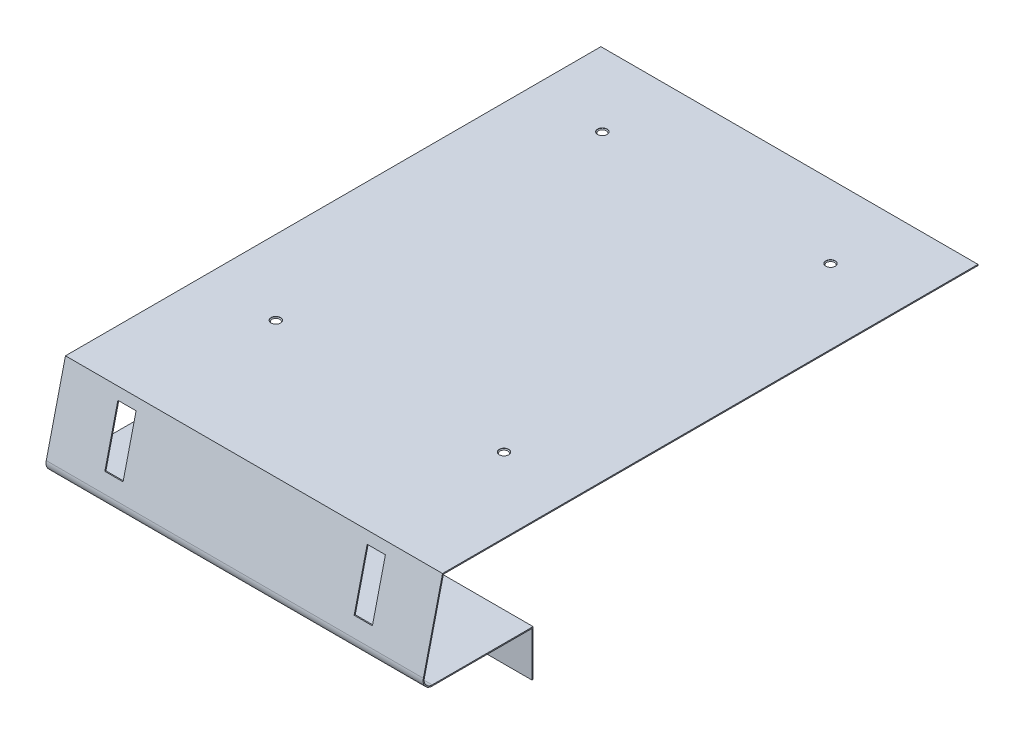
ISO-10303-21;
HEADER;
FILE_DESCRIPTION(('STEP AP214'),'2;1');
FILE_NAME('part.step','',(''),(''),'','','');
FILE_SCHEMA(('AUTOMOTIVE_DESIGN { 1 0 10303 214 1 1 1 1 }'));
ENDSEC;
DATA;
#1=APPLICATION_CONTEXT('core data for automotive mechanical design processes');
#2=APPLICATION_PROTOCOL_DEFINITION('international standard','automotive_design',2000,#1);
#3=PRODUCT_CONTEXT('',#1,'mechanical');
#4=PRODUCT('Part','Part','',(#3));
#5=PRODUCT_RELATED_PRODUCT_CATEGORY('part','',(#4));
#6=PRODUCT_DEFINITION_FORMATION('','',#4);
#7=PRODUCT_DEFINITION_CONTEXT('part definition',#1,'design');
#8=PRODUCT_DEFINITION('design','',#6,#7);
#9=PRODUCT_DEFINITION_SHAPE('','',#8);
#10=(LENGTH_UNIT() NAMED_UNIT(*) SI_UNIT(.MILLI.,.METRE.));
#11=(NAMED_UNIT(*) PLANE_ANGLE_UNIT() SI_UNIT($,.RADIAN.));
#12=(NAMED_UNIT(*) SI_UNIT($,.STERADIAN.) SOLID_ANGLE_UNIT());
#13=UNCERTAINTY_MEASURE_WITH_UNIT(LENGTH_MEASURE(1.E-05),#10,'distance_accuracy_value','');
#14=(GEOMETRIC_REPRESENTATION_CONTEXT(3) GLOBAL_UNCERTAINTY_ASSIGNED_CONTEXT((#13)) GLOBAL_UNIT_ASSIGNED_CONTEXT((#10,
#11,#12)) REPRESENTATION_CONTEXT('',''));
#15=CARTESIAN_POINT('',(0.,0.,0.));
#16=DIRECTION('',(0.,0.,1.));
#17=DIRECTION('',(1.,0.,0.));
#18=AXIS2_PLACEMENT_3D('',#15,#16,#17);
#19=CARTESIAN_POINT('',(-206.6,0.,293.957235481432));
#20=DIRECTION('',(0.,-0.230389426676569,-0.973098510982132));
#21=DIRECTION('',(0.,0.973098510982132,-0.230389426676569));
#22=AXIS2_PLACEMENT_3D('',#19,#20,#21);
#23=PLANE('',#22);
#24=DIRECTION('',(-1.,0.,0.));
#25=VECTOR('',#24,1.);
#26=CARTESIAN_POINT('',(-126.6,-9.7235326879881,296.259365323349));
#27=LINE('',#26,#25);
#28=CARTESIAN_POINT('',(-126.6,-9.7235326879881,296.259365323349));
#29=VERTEX_POINT('',#28);
#30=CARTESIAN_POINT('',(-146.6,-9.7235326879881,296.259365323349));
#31=VERTEX_POINT('',#30);
#32=EDGE_CURVE('E239',#29,#31,#27,.T.);
#33=ORIENTED_EDGE('',*,*,#32,.F.);
#34=DIRECTION('',(0.,-0.973098510982132,0.230389426676569));
#35=VECTOR('',#34,1.);
#36=CARTESIAN_POINT('',(-126.6,131.604562164318,262.798725543465));
#37=LINE('',#36,#35);
#38=CARTESIAN_POINT('',(-126.6,-70.,310.530336442282));
#39=VERTEX_POINT('',#38);
#40=EDGE_CURVE('E260',#29,#39,#37,.T.);
#41=ORIENTED_EDGE('',*,*,#40,.T.);
#42=DIRECTION('',(1.,0.,0.));
#43=VECTOR('',#42,1.);
#44=CARTESIAN_POINT('',(0.,-70.,310.530336442282));
#45=LINE('',#44,#43);
#46=CARTESIAN_POINT('',(-146.6,-70.,310.530336442282));
#47=VERTEX_POINT('',#46);
#48=EDGE_CURVE('E257',#47,#39,#45,.T.);
#49=ORIENTED_EDGE('',*,*,#48,.F.);
#50=DIRECTION('',(0.,-0.973098510982132,0.230389426676569));
#51=VECTOR('',#50,1.);
#52=CARTESIAN_POINT('',(-146.6,131.604562164318,262.798725543465));
#53=LINE('',#52,#51);
#54=EDGE_CURVE('E254',#31,#47,#53,.T.);
#55=ORIENTED_EDGE('',*,*,#54,.F.);
#56=EDGE_LOOP('',(#33,#41,#49,#55));
#57=FACE_BOUND('',#56,.T.);
#58=DIRECTION('',(1.,0.,0.));
#59=VECTOR('',#58,1.);
#60=CARTESIAN_POINT('',(-206.6,1.2,293.673125179246));
#61=LINE('',#60,#59);
#62=CARTESIAN_POINT('',(-206.6,1.2,293.673125179246));
#63=VERTEX_POINT('',#62);
#64=CARTESIAN_POINT('',(206.6,1.2,293.673125179246));
#65=VERTEX_POINT('',#64);
#66=EDGE_CURVE('E416',#63,#65,#61,.T.);
#67=ORIENTED_EDGE('',*,*,#66,.F.);
#68=DIRECTION('',(0.,0.973098510982132,-0.230389426676569));
#69=VECTOR('',#68,1.);
#70=CARTESIAN_POINT('',(-206.6,0.,293.957235481432));
#71=LINE('',#70,#69);
#72=CARTESIAN_POINT('',(-206.6,-87.6961057332343,314.720041398436));
#73=VERTEX_POINT('',#72);
#74=EDGE_CURVE('E413',#73,#63,#71,.T.);
#75=ORIENTED_EDGE('',*,*,#74,.F.);
#76=DIRECTION('',(1.,0.,0.));
#77=VECTOR('',#76,1.);
#78=CARTESIAN_POINT('',(-206.6,-87.6961057332343,314.720041398436));
#79=LINE('',#78,#77);
#80=CARTESIAN_POINT('',(206.6,-87.6961057332343,314.720041398436));
#81=VERTEX_POINT('',#80);
#82=EDGE_CURVE('E362',#73,#81,#79,.T.);
#83=ORIENTED_EDGE('',*,*,#82,.T.);
#84=DIRECTION('',(0.,0.973098510982132,-0.230389426676569));
#85=VECTOR('',#84,1.);
#86=CARTESIAN_POINT('',(206.6,0.,293.957235481432));
#87=LINE('',#86,#85);
#88=EDGE_CURVE('E388',#81,#65,#87,.T.);
#89=ORIENTED_EDGE('',*,*,#88,.T.);
#90=EDGE_LOOP('',(#67,#75,#83,#89));
#91=FACE_BOUND('',#90,.T.);
#92=DIRECTION('',(0.,-0.973098510982132,0.230389426676569));
#93=VECTOR('',#92,1.);
#94=CARTESIAN_POINT('',(126.6,131.604562164318,262.798725543465));
#95=LINE('',#94,#93);
#96=CARTESIAN_POINT('',(126.6,-9.7235326879881,296.259365323349));
#97=VERTEX_POINT('',#96);
#98=CARTESIAN_POINT('',(126.6,-70.,310.530336442282));
#99=VERTEX_POINT('',#98);
#100=EDGE_CURVE('E198',#97,#99,#95,.T.);
#101=ORIENTED_EDGE('',*,*,#100,.F.);
#102=DIRECTION('',(1.,0.,0.));
#103=VECTOR('',#102,1.);
#104=CARTESIAN_POINT('',(126.6,-9.7235326879881,296.259365323349));
#105=LINE('',#104,#103);
#106=CARTESIAN_POINT('',(146.6,-9.7235326879881,296.259365323349));
#107=VERTEX_POINT('',#106);
#108=EDGE_CURVE('E201',#97,#107,#105,.T.);
#109=ORIENTED_EDGE('',*,*,#108,.T.);
#110=DIRECTION('',(0.,-0.973098510982132,0.230389426676569));
#111=VECTOR('',#110,1.);
#112=CARTESIAN_POINT('',(146.6,131.604562164318,262.798725543465));
#113=LINE('',#112,#111);
#114=CARTESIAN_POINT('',(146.6,-70.,310.530336442282));
#115=VERTEX_POINT('',#114);
#116=EDGE_CURVE('E269',#107,#115,#113,.T.);
#117=ORIENTED_EDGE('',*,*,#116,.T.);
#118=DIRECTION('',(-1.,0.,0.));
#119=VECTOR('',#118,1.);
#120=CARTESIAN_POINT('',(1.4773281960804E-13,-70.,310.530336442282));
#121=LINE('',#120,#119);
#122=EDGE_CURVE('E203',#115,#99,#121,.T.);
#123=ORIENTED_EDGE('',*,*,#122,.T.);
#124=EDGE_LOOP('',(#101,#109,#117,#123));
#125=FACE_BOUND('',#124,.T.);
#126=ADVANCED_FACE('F34',(#57,#91,#125),#23,.F.);
#127=CARTESIAN_POINT('',(-206.6,-0.276467312011879,292.789517268254));
#128=DIRECTION('',(0.,-0.230389426676557,-0.973098510982135));
#129=DIRECTION('',(0.,0.973098510982135,-0.230389426676557));
#130=AXIS2_PLACEMENT_3D('',#127,#128,#129);
#131=PLANE('',#130);
#132=DIRECTION('',(0.,0.973098510982134,-0.230389426676557));
#133=VECTOR('',#132,1.);
#134=CARTESIAN_POINT('',(206.6,-0.276467312011879,292.789517268254));
#135=LINE('',#134,#133);
#136=CARTESIAN_POINT('',(206.6,-87.9725730452462,313.552323185258));
#137=VERTEX_POINT('',#136);
#138=CARTESIAN_POINT('',(206.6,0.,292.72406125862));
#139=VERTEX_POINT('',#138);
#140=EDGE_CURVE('E341',#137,#139,#135,.T.);
#141=ORIENTED_EDGE('',*,*,#140,.F.);
#142=DIRECTION('',(1.,0.,0.));
#143=VECTOR('',#142,1.);
#144=CARTESIAN_POINT('',(-206.6,-87.9725730452462,313.552323185258));
#145=LINE('',#144,#143);
#146=CARTESIAN_POINT('',(-206.6,-87.9725730452462,313.552323185258));
#147=VERTEX_POINT('',#146);
#148=EDGE_CURVE('E389',#147,#137,#145,.T.);
#149=ORIENTED_EDGE('',*,*,#148,.F.);
#150=DIRECTION('',(0.,0.973098510982132,-0.230389426676569));
#151=VECTOR('',#150,1.);
#152=CARTESIAN_POINT('',(-206.6,-0.276467312011879,292.789517268254));
#153=LINE('',#152,#151);
#154=CARTESIAN_POINT('',(-206.6,0.,292.72406125862));
#155=VERTEX_POINT('',#154);
#156=EDGE_CURVE('E359',#147,#155,#153,.T.);
#157=ORIENTED_EDGE('',*,*,#156,.T.);
#158=DIRECTION('',(1.,0.,0.));
#159=VECTOR('',#158,1.);
#160=CARTESIAN_POINT('',(-206.6,0.,292.72406125862));
#161=LINE('',#160,#159);
#162=EDGE_CURVE('E385',#155,#139,#161,.T.);
#163=ORIENTED_EDGE('',*,*,#162,.T.);
#164=EDGE_LOOP('',(#141,#149,#157,#163));
#165=FACE_BOUND('',#164,.T.);
#166=DIRECTION('',(-1.,0.,0.));
#167=VECTOR('',#166,1.);
#168=CARTESIAN_POINT('',(-126.6,-70.0835154141931,309.316935210773));
#169=LINE('',#168,#167);
#170=CARTESIAN_POINT('',(-126.6,-70.0835154141931,309.316935210773));
#171=VERTEX_POINT('',#170);
#172=CARTESIAN_POINT('',(-146.6,-70.0835154141931,309.316935210773));
#173=VERTEX_POINT('',#172);
#174=EDGE_CURVE('E246',#171,#173,#169,.T.);
#175=ORIENTED_EDGE('',*,*,#174,.F.);
#176=DIRECTION('',(0.,-0.973098510982135,0.230389426676557));
#177=VECTOR('',#176,1.);
#178=CARTESIAN_POINT('',(-126.6,131.3280948523,261.631007330289));
#179=LINE('',#178,#177);
#180=CARTESIAN_POINT('',(-126.6,-10.,295.09164711017));
#181=VERTEX_POINT('',#180);
#182=EDGE_CURVE('E251',#181,#171,#179,.T.);
#183=ORIENTED_EDGE('',*,*,#182,.F.);
#184=DIRECTION('',(1.,0.,0.));
#185=VECTOR('',#184,1.);
#186=CARTESIAN_POINT('',(0.,-10.,295.09164711017));
#187=LINE('',#186,#185);
#188=CARTESIAN_POINT('',(-146.6,-10.,295.09164711017));
#189=VERTEX_POINT('',#188);
#190=EDGE_CURVE('E263',#189,#181,#187,.T.);
#191=ORIENTED_EDGE('',*,*,#190,.F.);
#192=DIRECTION('',(0.,-0.973098510982135,0.230389426676557));
#193=VECTOR('',#192,1.);
#194=CARTESIAN_POINT('',(-146.6,131.3280948523,261.631007330289));
#195=LINE('',#194,#193);
#196=EDGE_CURVE('E249',#189,#173,#195,.T.);
#197=ORIENTED_EDGE('',*,*,#196,.T.);
#198=EDGE_LOOP('',(#175,#183,#191,#197));
#199=FACE_BOUND('',#198,.T.);
#200=DIRECTION('',(0.,-0.973098510982135,0.230389426676557));
#201=VECTOR('',#200,1.);
#202=CARTESIAN_POINT('',(126.6,131.3280948523,261.631007330289));
#203=LINE('',#202,#201);
#204=CARTESIAN_POINT('',(126.6,-10.,295.09164711017));
#205=VERTEX_POINT('',#204);
#206=CARTESIAN_POINT('',(126.6,-70.0835154141931,309.316935210773));
#207=VERTEX_POINT('',#206);
#208=EDGE_CURVE('E220',#205,#207,#203,.T.);
#209=ORIENTED_EDGE('',*,*,#208,.T.);
#210=DIRECTION('',(1.,0.,0.));
#211=VECTOR('',#210,1.);
#212=CARTESIAN_POINT('',(126.6,-70.0835154141931,309.316935210773));
#213=LINE('',#212,#211);
#214=CARTESIAN_POINT('',(146.6,-70.0835154141931,309.316935210773));
#215=VERTEX_POINT('',#214);
#216=EDGE_CURVE('E217',#207,#215,#213,.T.);
#217=ORIENTED_EDGE('',*,*,#216,.T.);
#218=DIRECTION('',(0.,-0.973098510982135,0.230389426676557));
#219=VECTOR('',#218,1.);
#220=CARTESIAN_POINT('',(146.6,131.3280948523,261.631007330289));
#221=LINE('',#220,#219);
#222=CARTESIAN_POINT('',(146.6,-9.99999999999996,295.09164711017));
#223=VERTEX_POINT('',#222);
#224=EDGE_CURVE('E207',#223,#215,#221,.T.);
#225=ORIENTED_EDGE('',*,*,#224,.F.);
#226=DIRECTION('',(-1.,0.,0.));
#227=VECTOR('',#226,1.);
#228=CARTESIAN_POINT('',(1.22205331149274E-13,-10.,295.09164711017));
#229=LINE('',#228,#227);
#230=EDGE_CURVE('E252',#223,#205,#229,.T.);
#231=ORIENTED_EDGE('',*,*,#230,.T.);
#232=EDGE_LOOP('',(#209,#217,#225,#231));
#233=FACE_BOUND('',#232,.T.);
#234=ADVANCED_FACE('F434',(#165,#199,#233),#131,.T.);
#235=CARTESIAN_POINT('',(-206.6,-149.,195.633093996933));
#236=DIRECTION('',(0.,-1.,0.));
#237=DIRECTION('',(0.,0.,-1.));
#238=AXIS2_PLACEMENT_3D('',#235,#236,#237);
#239=PLANE('',#238);
#240=DIRECTION('',(0.,0.,1.));
#241=VECTOR('',#240,1.);
#242=CARTESIAN_POINT('',(-40.,-149.,-293.061));
#243=LINE('',#242,#241);
#244=CARTESIAN_POINT('',(-40.,-149.,194.433093996933));
#245=VERTEX_POINT('',#244);
#246=CARTESIAN_POINT('',(-40.,-149.,195.633093996932));
#247=VERTEX_POINT('',#246);
#248=EDGE_CURVE('E283',#245,#247,#243,.T.);
#249=ORIENTED_EDGE('',*,*,#248,.T.);
#250=DIRECTION('',(1.,0.,0.));
#251=VECTOR('',#250,1.);
#252=CARTESIAN_POINT('',(-206.6,-149.,195.633093996933));
#253=LINE('',#252,#251);
#254=CARTESIAN_POINT('',(-206.6,-149.,195.633093996933));
#255=VERTEX_POINT('',#254);
#256=EDGE_CURVE('E400',#255,#247,#253,.T.);
#257=ORIENTED_EDGE('',*,*,#256,.F.);
#258=DIRECTION('',(0.,0.,-1.));
#259=VECTOR('',#258,1.);
#260=CARTESIAN_POINT('',(-206.6,-149.,195.633093996933));
#261=LINE('',#260,#259);
#262=CARTESIAN_POINT('',(-206.6,-149.,194.433093996933));
#263=VERTEX_POINT('',#262);
#264=EDGE_CURVE('E347',#255,#263,#261,.T.);
#265=ORIENTED_EDGE('',*,*,#264,.T.);
#266=DIRECTION('',(1.,0.,0.));
#267=VECTOR('',#266,1.);
#268=CARTESIAN_POINT('',(-206.6,-149.,194.433093996933));
#269=LINE('',#268,#267);
#270=EDGE_CURVE('E396',#263,#245,#269,.T.);
#271=ORIENTED_EDGE('',*,*,#270,.T.);
#272=EDGE_LOOP('',(#249,#257,#265,#271));
#273=FACE_BOUND('',#272,.T.);
#274=ADVANCED_FACE('F449',(#273),#239,.T.);
#275=CARTESIAN_POINT('',(-206.6,-100.,195.633093996933));
#276=DIRECTION('',(0.,0.,1.));
#277=DIRECTION('',(0.,-1.,0.));
#278=AXIS2_PLACEMENT_3D('',#275,#276,#277);
#279=PLANE('',#278);
#280=DIRECTION('',(0.,-1.,0.));
#281=VECTOR('',#280,1.);
#282=CARTESIAN_POINT('',(-40.,-149.,195.633093996932));
#283=LINE('',#282,#281);
#284=CARTESIAN_POINT('',(-40.,-99.9999999999998,195.633093996932));
#285=VERTEX_POINT('',#284);
#286=EDGE_CURVE('E280',#285,#247,#283,.T.);
#287=ORIENTED_EDGE('',*,*,#286,.F.);
#288=DIRECTION('',(1.,0.,0.));
#289=VECTOR('',#288,1.);
#290=CARTESIAN_POINT('',(-206.6,-100.,195.633093996933));
#291=LINE('',#290,#289);
#292=CARTESIAN_POINT('',(-206.6,-100.,195.633093996933));
#293=VERTEX_POINT('',#292);
#294=EDGE_CURVE('E404',#293,#285,#291,.T.);
#295=ORIENTED_EDGE('',*,*,#294,.F.);
#296=DIRECTION('',(0.,-1.,0.));
#297=VECTOR('',#296,1.);
#298=CARTESIAN_POINT('',(-206.6,-100.,195.633093996933));
#299=LINE('',#298,#297);
#300=EDGE_CURVE('E344',#293,#255,#299,.T.);
#301=ORIENTED_EDGE('',*,*,#300,.T.);
#302=ORIENTED_EDGE('',*,*,#256,.T.);
#303=EDGE_LOOP('',(#287,#295,#301,#302));
#304=FACE_BOUND('',#303,.T.);
#305=ADVANCED_FACE('F454',(#304),#279,.T.);
#306=CARTESIAN_POINT('',(0.,0.,0.));
#307=DIRECTION('',(0.,1.,0.));
#308=DIRECTION('',(0.,0.,1.));
#309=AXIS2_PLACEMENT_3D('',#306,#307,#308);
#310=PLANE('',#309);
#311=CARTESIAN_POINT('',(-125.,0.,-213.06));
#312=DIRECTION('',(0.,1.,0.));
#313=DIRECTION('',(0.,0.,1.));
#314=AXIS2_PLACEMENT_3D('',#311,#312,#313);
#315=CIRCLE('',#314,4.3);
#316=CARTESIAN_POINT('',(-125.,0.,-208.76));
#317=VERTEX_POINT('',#316);
#318=EDGE_CURVE('E298',#317,#317,#315,.T.);
#319=ORIENTED_EDGE('',*,*,#318,.T.);
#320=EDGE_LOOP('',(#319));
#321=FACE_BOUND('',#320,.T.);
#322=CARTESIAN_POINT('',(125.,0.,-213.06));
#323=DIRECTION('',(0.,1.,0.));
#324=DIRECTION('',(0.,0.,1.));
#325=AXIS2_PLACEMENT_3D('',#322,#323,#324);
#326=CIRCLE('',#325,4.30000000000001);
#327=CARTESIAN_POINT('',(125.,0.,-208.76));
#328=VERTEX_POINT('',#327);
#329=EDGE_CURVE('E307',#328,#328,#326,.T.);
#330=ORIENTED_EDGE('',*,*,#329,.T.);
#331=EDGE_LOOP('',(#330));
#332=FACE_BOUND('',#331,.T.);
#333=CARTESIAN_POINT('',(125.,0.,144.74));
#334=DIRECTION('',(0.,1.,0.));
#335=DIRECTION('',(0.,0.,1.));
#336=AXIS2_PLACEMENT_3D('',#333,#334,#335);
#337=CIRCLE('',#336,4.30000000000001);
#338=CARTESIAN_POINT('',(125.,0.,149.04));
#339=VERTEX_POINT('',#338);
#340=EDGE_CURVE('E316',#339,#339,#337,.T.);
#341=ORIENTED_EDGE('',*,*,#340,.T.);
#342=EDGE_LOOP('',(#341));
#343=FACE_BOUND('',#342,.T.);
#344=CARTESIAN_POINT('',(-125.,0.,144.74));
#345=DIRECTION('',(0.,1.,0.));
#346=DIRECTION('',(0.,0.,1.));
#347=AXIS2_PLACEMENT_3D('',#344,#345,#346);
#348=CIRCLE('',#347,4.3);
#349=CARTESIAN_POINT('',(-125.,0.,149.04));
#350=VERTEX_POINT('',#349);
#351=EDGE_CURVE('E325',#350,#350,#348,.T.);
#352=ORIENTED_EDGE('',*,*,#351,.T.);
#353=EDGE_LOOP('',(#352));
#354=FACE_BOUND('',#353,.T.);
#355=DIRECTION('',(0.,0.,1.));
#356=VECTOR('',#355,1.);
#357=CARTESIAN_POINT('',(-206.6,0.,-294.06));
#358=LINE('',#357,#356);
#359=CARTESIAN_POINT('',(-206.6,0.,-293.06));
#360=VERTEX_POINT('',#359);
#361=EDGE_CURVE('E38',#360,#155,#358,.T.);
#362=ORIENTED_EDGE('',*,*,#361,.F.);
#363=DIRECTION('',(-1.,0.,0.));
#364=VECTOR('',#363,1.);
#365=CARTESIAN_POINT('',(-206.6,0.,-293.06));
#366=LINE('',#365,#364);
#367=CARTESIAN_POINT('',(206.6,0.,-293.06));
#368=VERTEX_POINT('',#367);
#369=EDGE_CURVE('E333',#368,#360,#366,.T.);
#370=ORIENTED_EDGE('',*,*,#369,.F.);
#371=DIRECTION('',(0.,0.,-1.));
#372=VECTOR('',#371,1.);
#373=CARTESIAN_POINT('',(206.6,0.,-294.06));
#374=LINE('',#373,#372);
#375=EDGE_CURVE('E419',#139,#368,#374,.T.);
#376=ORIENTED_EDGE('',*,*,#375,.F.);
#377=ORIENTED_EDGE('',*,*,#162,.F.);
#378=EDGE_LOOP('',(#362,#370,#376,#377));
#379=FACE_BOUND('',#378,.T.);
#380=ADVANCED_FACE('F432',(#321,#332,#343,#354,#379),#310,.F.);
#381=CARTESIAN_POINT('',(206.6,1.2,-294.06));
#382=DIRECTION('',(-1.,0.,0.));
#383=DIRECTION('',(0.,0.,1.));
#384=AXIS2_PLACEMENT_3D('',#381,#382,#383);
#385=PLANE('',#384);
#386=ORIENTED_EDGE('',*,*,#375,.T.);
#387=DIRECTION('',(0.,1.,0.));
#388=VECTOR('',#387,1.);
#389=CARTESIAN_POINT('',(206.6,-149.001,-293.06));
#390=LINE('',#389,#388);
#391=CARTESIAN_POINT('',(206.6,1.2,-293.06));
#392=VERTEX_POINT('',#391);
#393=EDGE_CURVE('E330',#368,#392,#390,.T.);
#394=ORIENTED_EDGE('',*,*,#393,.T.);
#395=DIRECTION('',(0.,0.,-1.));
#396=VECTOR('',#395,1.);
#397=CARTESIAN_POINT('',(206.6,1.2,-294.06));
#398=LINE('',#397,#396);
#399=EDGE_CURVE('E43',#65,#392,#398,.T.);
#400=ORIENTED_EDGE('',*,*,#399,.F.);
#401=ORIENTED_EDGE('',*,*,#88,.F.);
#402=CARTESIAN_POINT('',(206.6,-90.,304.989056288615));
#403=DIRECTION('',(1.,0.,0.));
#404=DIRECTION('',(0.,0.,-1.));
#405=AXIS2_PLACEMENT_3D('',#402,#403,#404);
#406=CIRCLE('',#405,9.99999999999999);
#407=CARTESIAN_POINT('',(206.6,-100.,304.989056288615));
#408=VERTEX_POINT('',#407);
#409=EDGE_CURVE('E336',#81,#408,#406,.T.);
#410=ORIENTED_EDGE('',*,*,#409,.T.);
#411=DIRECTION('',(0.,0.,-1.));
#412=VECTOR('',#411,1.);
#413=CARTESIAN_POINT('',(206.6,-100.,304.989056288615));
#414=LINE('',#413,#412);
#415=CARTESIAN_POINT('',(206.6,-100.,195.633093996933));
#416=VERTEX_POINT('',#415);
#417=EDGE_CURVE('E365',#408,#416,#414,.T.);
#418=ORIENTED_EDGE('',*,*,#417,.T.);
#419=DIRECTION('',(0.,-1.,0.));
#420=VECTOR('',#419,1.);
#421=CARTESIAN_POINT('',(206.6,-100.,195.633093996933));
#422=LINE('',#421,#420);
#423=CARTESIAN_POINT('',(206.6,-149.,195.633093996933));
#424=VERTEX_POINT('',#423);
#425=EDGE_CURVE('E368',#416,#424,#422,.T.);
#426=ORIENTED_EDGE('',*,*,#425,.T.);
#427=DIRECTION('',(0.,0.,-1.));
#428=VECTOR('',#427,1.);
#429=CARTESIAN_POINT('',(206.6,-149.,195.633093996933));
#430=LINE('',#429,#428);
#431=CARTESIAN_POINT('',(206.6,-149.,194.433093996933));
#432=VERTEX_POINT('',#431);
#433=EDGE_CURVE('E371',#424,#432,#430,.T.);
#434=ORIENTED_EDGE('',*,*,#433,.T.);
#435=DIRECTION('',(0.,1.,0.));
#436=VECTOR('',#435,1.);
#437=CARTESIAN_POINT('',(206.6,-98.8,194.433093996933));
#438=LINE('',#437,#436);
#439=CARTESIAN_POINT('',(206.6,-98.8,194.433093996933));
#440=VERTEX_POINT('',#439);
#441=EDGE_CURVE('E374',#432,#440,#438,.T.);
#442=ORIENTED_EDGE('',*,*,#441,.T.);
#443=DIRECTION('',(0.,0.,1.));
#444=VECTOR('',#443,1.);
#445=CARTESIAN_POINT('',(206.6,-98.8,304.989056288615));
#446=LINE('',#445,#444);
#447=CARTESIAN_POINT('',(206.6,-98.8,304.989056288615));
#448=VERTEX_POINT('',#447);
#449=EDGE_CURVE('E377',#440,#448,#446,.T.);
#450=ORIENTED_EDGE('',*,*,#449,.T.);
#451=CARTESIAN_POINT('',(206.6,-90.,304.989056288615));
#452=DIRECTION('',(-1.,0.,0.));
#453=DIRECTION('',(0.,0.,-1.));
#454=AXIS2_PLACEMENT_3D('',#451,#452,#453);
#455=CIRCLE('',#454,8.80000000000001);
#456=EDGE_CURVE('E380',#448,#137,#455,.T.);
#457=ORIENTED_EDGE('',*,*,#456,.T.);
#458=ORIENTED_EDGE('',*,*,#140,.T.);
#459=EDGE_LOOP('',(#386,#394,#400,#401,#410,#418,#426,#434,#442,#450,#457,#458));
#460=FACE_BOUND('',#459,.T.);
#461=ADVANCED_FACE('F36',(#460),#385,.F.);
#462=CARTESIAN_POINT('',(-206.6,1.2,-294.06));
#463=DIRECTION('',(1.,0.,0.));
#464=DIRECTION('',(0.,0.,-1.));
#465=AXIS2_PLACEMENT_3D('',#462,#463,#464);
#466=PLANE('',#465);
#467=DIRECTION('',(0.,0.,1.));
#468=VECTOR('',#467,1.);
#469=CARTESIAN_POINT('',(-206.6,1.2,-294.06));
#470=LINE('',#469,#468);
#471=CARTESIAN_POINT('',(-206.6,1.2,-293.06));
#472=VERTEX_POINT('',#471);
#473=EDGE_CURVE('E11',#472,#63,#470,.T.);
#474=ORIENTED_EDGE('',*,*,#473,.F.);
#475=DIRECTION('',(0.,1.,0.));
#476=VECTOR('',#475,1.);
#477=CARTESIAN_POINT('',(-206.6,-149.001,-293.06));
#478=LINE('',#477,#476);
#479=EDGE_CURVE('E59',#360,#472,#478,.T.);
#480=ORIENTED_EDGE('',*,*,#479,.F.);
#481=ORIENTED_EDGE('',*,*,#361,.T.);
#482=ORIENTED_EDGE('',*,*,#156,.F.);
#483=CARTESIAN_POINT('',(-206.6,-90.,304.989056288615));
#484=DIRECTION('',(-1.,0.,0.));
#485=DIRECTION('',(0.,0.,-1.));
#486=AXIS2_PLACEMENT_3D('',#483,#484,#485);
#487=CIRCLE('',#486,8.80000000000001);
#488=CARTESIAN_POINT('',(-206.6,-98.8,304.989056288615));
#489=VERTEX_POINT('',#488);
#490=EDGE_CURVE('E356',#489,#147,#487,.T.);
#491=ORIENTED_EDGE('',*,*,#490,.F.);
#492=DIRECTION('',(0.,0.,1.));
#493=VECTOR('',#492,1.);
#494=CARTESIAN_POINT('',(-206.6,-98.8,304.989056288615));
#495=LINE('',#494,#493);
#496=CARTESIAN_POINT('',(-206.6,-98.8,194.433093996933));
#497=VERTEX_POINT('',#496);
#498=EDGE_CURVE('E353',#497,#489,#495,.T.);
#499=ORIENTED_EDGE('',*,*,#498,.F.);
#500=DIRECTION('',(0.,1.,0.));
#501=VECTOR('',#500,1.);
#502=CARTESIAN_POINT('',(-206.6,-98.8,194.433093996933));
#503=LINE('',#502,#501);
#504=EDGE_CURVE('E350',#263,#497,#503,.T.);
#505=ORIENTED_EDGE('',*,*,#504,.F.);
#506=ORIENTED_EDGE('',*,*,#264,.F.);
#507=ORIENTED_EDGE('',*,*,#300,.F.);
#508=DIRECTION('',(0.,0.,-1.));
#509=VECTOR('',#508,1.);
#510=CARTESIAN_POINT('',(-206.6,-100.,304.989056288615));
#511=LINE('',#510,#509);
#512=CARTESIAN_POINT('',(-206.6,-100.,304.989056288615));
#513=VERTEX_POINT('',#512);
#514=EDGE_CURVE('E340',#513,#293,#511,.T.);
#515=ORIENTED_EDGE('',*,*,#514,.F.);
#516=CARTESIAN_POINT('',(-206.6,-90.,304.989056288615));
#517=DIRECTION('',(1.,0.,0.));
#518=DIRECTION('',(0.,0.,-1.));
#519=AXIS2_PLACEMENT_3D('',#516,#517,#518);
#520=CIRCLE('',#519,9.99999999999999);
#521=EDGE_CURVE('E337',#73,#513,#520,.T.);
#522=ORIENTED_EDGE('',*,*,#521,.F.);
#523=ORIENTED_EDGE('',*,*,#74,.T.);
#524=EDGE_LOOP('',(#474,#480,#481,#482,#491,#499,#505,#506,#507,#515,#522,#523));
#525=FACE_BOUND('',#524,.T.);
#526=ADVANCED_FACE('F428',(#525),#466,.F.);
#527=CARTESIAN_POINT('',(0.,1.2,0.));
#528=DIRECTION('',(0.,1.,0.));
#529=DIRECTION('',(0.,0.,1.));
#530=AXIS2_PLACEMENT_3D('',#527,#528,#529);
#531=PLANE('',#530);
#532=CARTESIAN_POINT('',(-125.,1.2,-213.06));
#533=DIRECTION('',(0.,1.,0.));
#534=DIRECTION('',(0.,0.,1.));
#535=AXIS2_PLACEMENT_3D('',#532,#533,#534);
#536=CIRCLE('',#535,5.20000000000001);
#537=CARTESIAN_POINT('',(-125.,1.2,-207.86));
#538=VERTEX_POINT('',#537);
#539=EDGE_CURVE('E286',#538,#538,#536,.T.);
#540=ORIENTED_EDGE('',*,*,#539,.F.);
#541=EDGE_LOOP('',(#540));
#542=FACE_BOUND('',#541,.T.);
#543=CARTESIAN_POINT('',(125.,1.2,-213.06));
#544=DIRECTION('',(0.,1.,0.));
#545=DIRECTION('',(0.,0.,1.));
#546=AXIS2_PLACEMENT_3D('',#543,#544,#545);
#547=CIRCLE('',#546,5.20000000000001);
#548=CARTESIAN_POINT('',(125.,1.2,-207.86));
#549=VERTEX_POINT('',#548);
#550=EDGE_CURVE('E301',#549,#549,#547,.T.);
#551=ORIENTED_EDGE('',*,*,#550,.F.);
#552=EDGE_LOOP('',(#551));
#553=FACE_BOUND('',#552,.T.);
#554=CARTESIAN_POINT('',(125.,1.2,144.74));
#555=DIRECTION('',(0.,1.,0.));
#556=DIRECTION('',(0.,0.,1.));
#557=AXIS2_PLACEMENT_3D('',#554,#555,#556);
#558=CIRCLE('',#557,5.20000000000001);
#559=CARTESIAN_POINT('',(125.,1.2,149.94));
#560=VERTEX_POINT('',#559);
#561=EDGE_CURVE('E310',#560,#560,#558,.T.);
#562=ORIENTED_EDGE('',*,*,#561,.F.);
#563=EDGE_LOOP('',(#562));
#564=FACE_BOUND('',#563,.T.);
#565=CARTESIAN_POINT('',(-125.,1.2,144.74));
#566=DIRECTION('',(0.,1.,0.));
#567=DIRECTION('',(0.,0.,1.));
#568=AXIS2_PLACEMENT_3D('',#565,#566,#567);
#569=CIRCLE('',#568,5.20000000000001);
#570=CARTESIAN_POINT('',(-125.,1.2,149.94));
#571=VERTEX_POINT('',#570);
#572=EDGE_CURVE('E319',#571,#571,#569,.T.);
#573=ORIENTED_EDGE('',*,*,#572,.F.);
#574=EDGE_LOOP('',(#573));
#575=FACE_BOUND('',#574,.T.);
#576=DIRECTION('',(1.,0.,0.));
#577=VECTOR('',#576,1.);
#578=CARTESIAN_POINT('',(-206.6,1.2,-293.06));
#579=LINE('',#578,#577);
#580=EDGE_CURVE('E328',#472,#392,#579,.T.);
#581=ORIENTED_EDGE('',*,*,#580,.F.);
#582=ORIENTED_EDGE('',*,*,#473,.T.);
#583=ORIENTED_EDGE('',*,*,#66,.T.);
#584=ORIENTED_EDGE('',*,*,#399,.T.);
#585=EDGE_LOOP('',(#581,#582,#583,#584));
#586=FACE_BOUND('',#585,.T.);
#587=ADVANCED_FACE('F467',(#542,#553,#564,#575,#586),#531,.T.);
#588=CARTESIAN_POINT('',(-206.6,-90.,304.989056288615));
#589=DIRECTION('',(1.,0.,0.));
#590=DIRECTION('',(0.,0.,-1.));
#591=AXIS2_PLACEMENT_3D('',#588,#589,#590);
#592=CYLINDRICAL_SURFACE('',#591,8.80000000000001);
#593=ORIENTED_EDGE('',*,*,#456,.F.);
#594=DIRECTION('',(1.,0.,0.));
#595=VECTOR('',#594,1.);
#596=CARTESIAN_POINT('',(-206.6,-98.8,304.989056288615));
#597=LINE('',#596,#595);
#598=EDGE_CURVE('E392',#489,#448,#597,.T.);
#599=ORIENTED_EDGE('',*,*,#598,.F.);
#600=ORIENTED_EDGE('',*,*,#490,.T.);
#601=ORIENTED_EDGE('',*,*,#148,.T.);
#602=EDGE_LOOP('',(#593,#599,#600,#601));
#603=FACE_BOUND('',#602,.T.);
#604=ADVANCED_FACE('F438',(#603),#592,.F.);
#605=CARTESIAN_POINT('',(-206.6,-98.8,304.989056288615));
#606=DIRECTION('',(0.,1.,0.));
#607=DIRECTION('',(0.,0.,1.));
#608=AXIS2_PLACEMENT_3D('',#605,#606,#607);
#609=PLANE('',#608);
#610=ORIENTED_EDGE('',*,*,#449,.F.);
#611=DIRECTION('',(1.,0.,0.));
#612=VECTOR('',#611,1.);
#613=CARTESIAN_POINT('',(-206.6,-98.8,194.433093996933));
#614=LINE('',#613,#612);
#615=EDGE_CURVE('E394',#497,#440,#614,.T.);
#616=ORIENTED_EDGE('',*,*,#615,.F.);
#617=ORIENTED_EDGE('',*,*,#498,.T.);
#618=ORIENTED_EDGE('',*,*,#598,.T.);
#619=EDGE_LOOP('',(#610,#616,#617,#618));
#620=FACE_BOUND('',#619,.T.);
#621=ADVANCED_FACE('F442',(#620),#609,.T.);
#622=CARTESIAN_POINT('',(-206.6,-98.8,194.433093996933));
#623=DIRECTION('',(0.,0.,-1.));
#624=DIRECTION('',(-1.,0.,0.));
#625=AXIS2_PLACEMENT_3D('',#622,#623,#624);
#626=PLANE('',#625);
#627=DIRECTION('',(0.,-1.,0.));
#628=VECTOR('',#627,1.);
#629=CARTESIAN_POINT('',(-40.,-149.,194.433093996933));
#630=LINE('',#629,#628);
#631=CARTESIAN_POINT('',(-40.,-99.9999999999998,194.433093996933));
#632=VERTEX_POINT('',#631);
#633=EDGE_CURVE('E277',#632,#245,#630,.T.);
#634=ORIENTED_EDGE('',*,*,#633,.T.);
#635=ORIENTED_EDGE('',*,*,#270,.F.);
#636=ORIENTED_EDGE('',*,*,#504,.T.);
#637=ORIENTED_EDGE('',*,*,#615,.T.);
#638=ORIENTED_EDGE('',*,*,#441,.F.);
#639=CARTESIAN_POINT('',(40.,-149.,194.433093996933));
#640=VERTEX_POINT('',#639);
#641=EDGE_CURVE('E399',#640,#432,#269,.T.);
#642=ORIENTED_EDGE('',*,*,#641,.F.);
#643=DIRECTION('',(0.,1.,0.));
#644=VECTOR('',#643,1.);
#645=CARTESIAN_POINT('',(40.,-149.,194.433093996932));
#646=LINE('',#645,#644);
#647=CARTESIAN_POINT('',(40.0000000000001,-99.9999999999998,194.433093996932));
#648=VERTEX_POINT('',#647);
#649=EDGE_CURVE('E265',#640,#648,#646,.T.);
#650=ORIENTED_EDGE('',*,*,#649,.T.);
#651=DIRECTION('',(-1.,0.,0.));
#652=VECTOR('',#651,1.);
#653=CARTESIAN_POINT('',(-39.9999999999999,-99.9999999999998,194.433093996933));
#654=LINE('',#653,#652);
#655=EDGE_CURVE('E274',#648,#632,#654,.T.);
#656=ORIENTED_EDGE('',*,*,#655,.T.);
#657=EDGE_LOOP('',(#634,#635,#636,#637,#638,#642,#650,#656));
#658=FACE_BOUND('',#657,.T.);
#659=ADVANCED_FACE('F447',(#658),#626,.T.);
#660=DIRECTION('',(0.,0.,1.));
#661=VECTOR('',#660,1.);
#662=CARTESIAN_POINT('',(40.,-149.,-293.061));
#663=LINE('',#662,#661);
#664=CARTESIAN_POINT('',(40.,-149.,195.633093996932));
#665=VERTEX_POINT('',#664);
#666=EDGE_CURVE('E289',#640,#665,#663,.T.);
#667=ORIENTED_EDGE('',*,*,#666,.F.);
#668=ORIENTED_EDGE('',*,*,#641,.T.);
#669=ORIENTED_EDGE('',*,*,#433,.F.);
#670=EDGE_CURVE('E403',#665,#424,#253,.T.);
#671=ORIENTED_EDGE('',*,*,#670,.F.);
#672=EDGE_LOOP('',(#667,#668,#669,#671));
#673=FACE_BOUND('',#672,.T.);
#674=ADVANCED_FACE('F478',(#673),#239,.T.);
#675=DIRECTION('',(0.,1.,0.));
#676=VECTOR('',#675,1.);
#677=CARTESIAN_POINT('',(40.,-149.,195.633093996932));
#678=LINE('',#677,#676);
#679=CARTESIAN_POINT('',(40.0000000000001,-100.,195.633093996933));
#680=VERTEX_POINT('',#679);
#681=EDGE_CURVE('E51',#665,#680,#678,.T.);
#682=ORIENTED_EDGE('',*,*,#681,.F.);
#683=ORIENTED_EDGE('',*,*,#670,.T.);
#684=ORIENTED_EDGE('',*,*,#425,.F.);
#685=EDGE_CURVE('E407',#680,#416,#291,.T.);
#686=ORIENTED_EDGE('',*,*,#685,.F.);
#687=EDGE_LOOP('',(#682,#683,#684,#686));
#688=FACE_BOUND('',#687,.T.);
#689=ADVANCED_FACE('F473',(#688),#279,.T.);
#690=CARTESIAN_POINT('',(-206.6,-100.,304.989056288615));
#691=DIRECTION('',(0.,-1.,0.));
#692=DIRECTION('',(0.,0.,-1.));
#693=AXIS2_PLACEMENT_3D('',#690,#691,#692);
#694=PLANE('',#693);
#695=ORIENTED_EDGE('',*,*,#417,.F.);
#696=DIRECTION('',(1.,0.,0.));
#697=VECTOR('',#696,1.);
#698=CARTESIAN_POINT('',(-206.6,-100.,304.989056288615));
#699=LINE('',#698,#697);
#700=EDGE_CURVE('E408',#513,#408,#699,.T.);
#701=ORIENTED_EDGE('',*,*,#700,.F.);
#702=ORIENTED_EDGE('',*,*,#514,.T.);
#703=ORIENTED_EDGE('',*,*,#294,.T.);
#704=DIRECTION('',(0.,0.,1.));
#705=VECTOR('',#704,1.);
#706=CARTESIAN_POINT('',(-40.,-99.9999999999998,-293.061));
#707=LINE('',#706,#705);
#708=EDGE_CURVE('E284',#632,#285,#707,.T.);
#709=ORIENTED_EDGE('',*,*,#708,.F.);
#710=ORIENTED_EDGE('',*,*,#655,.F.);
#711=DIRECTION('',(0.,0.,1.));
#712=VECTOR('',#711,1.);
#713=CARTESIAN_POINT('',(40.0000000000001,-99.9999999999998,-293.061));
#714=LINE('',#713,#712);
#715=EDGE_CURVE('E287',#648,#680,#714,.T.);
#716=ORIENTED_EDGE('',*,*,#715,.T.);
#717=ORIENTED_EDGE('',*,*,#685,.T.);
#718=EDGE_LOOP('',(#695,#701,#702,#703,#709,#710,#716,#717));
#719=FACE_BOUND('',#718,.T.);
#720=ADVANCED_FACE('F458',(#719),#694,.T.);
#721=CARTESIAN_POINT('',(-206.6,-90.,304.989056288615));
#722=DIRECTION('',(1.,0.,0.));
#723=DIRECTION('',(0.,0.,-1.));
#724=AXIS2_PLACEMENT_3D('',#721,#722,#723);
#725=CYLINDRICAL_SURFACE('',#724,9.99999999999999);
#726=ORIENTED_EDGE('',*,*,#409,.F.);
#727=ORIENTED_EDGE('',*,*,#82,.F.);
#728=ORIENTED_EDGE('',*,*,#521,.T.);
#729=ORIENTED_EDGE('',*,*,#700,.T.);
#730=EDGE_LOOP('',(#726,#727,#728,#729));
#731=FACE_BOUND('',#730,.T.);
#732=ADVANCED_FACE('F463',(#731),#725,.T.);
#733=CARTESIAN_POINT('',(-206.6,-149.001,-293.06));
#734=DIRECTION('',(0.,0.,1.));
#735=DIRECTION('',(1.,0.,0.));
#736=AXIS2_PLACEMENT_3D('',#733,#734,#735);
#737=PLANE('',#736);
#738=ORIENTED_EDGE('',*,*,#369,.T.);
#739=ORIENTED_EDGE('',*,*,#479,.T.);
#740=ORIENTED_EDGE('',*,*,#580,.T.);
#741=ORIENTED_EDGE('',*,*,#393,.F.);
#742=EDGE_LOOP('',(#738,#739,#740,#741));
#743=FACE_BOUND('',#742,.T.);
#744=ADVANCED_FACE('F469',(#743),#737,.F.);
#745=CARTESIAN_POINT('',(-125.,0.9,144.74));
#746=DIRECTION('',(0.,1.,0.));
#747=DIRECTION('',(0.,0.,1.));
#748=AXIS2_PLACEMENT_3D('',#745,#746,#747);
#749=CONICAL_SURFACE('',#748,5.2,0.785398163397447);
#750=ORIENTED_EDGE('',*,*,#351,.F.);
#751=EDGE_LOOP('',(#750));
#752=FACE_BOUND('',#751,.T.);
#753=CARTESIAN_POINT('',(-125.,0.9,144.74));
#754=DIRECTION('',(0.,1.,0.));
#755=DIRECTION('',(0.,0.,1.));
#756=AXIS2_PLACEMENT_3D('',#753,#754,#755);
#757=CIRCLE('',#756,5.2);
#758=CARTESIAN_POINT('',(-125.,0.9,149.94));
#759=VERTEX_POINT('',#758);
#760=EDGE_CURVE('E322',#759,#759,#757,.T.);
#761=ORIENTED_EDGE('',*,*,#760,.T.);
#762=EDGE_LOOP('',(#761));
#763=FACE_BOUND('',#762,.T.);
#764=ADVANCED_FACE('F728',(#752,#763),#749,.F.);
#765=CARTESIAN_POINT('',(-125.,1.2,144.74));
#766=DIRECTION('',(0.,1.,0.));
#767=DIRECTION('',(0.,0.,1.));
#768=AXIS2_PLACEMENT_3D('',#765,#766,#767);
#769=CYLINDRICAL_SURFACE('',#768,5.2);
#770=ORIENTED_EDGE('',*,*,#760,.F.);
#771=EDGE_LOOP('',(#770));
#772=FACE_BOUND('',#771,.T.);
#773=ORIENTED_EDGE('',*,*,#572,.T.);
#774=EDGE_LOOP('',(#773));
#775=FACE_BOUND('',#774,.T.);
#776=ADVANCED_FACE('F719',(#772,#775),#769,.F.);
#777=CARTESIAN_POINT('',(125.,0.9,144.74));
#778=DIRECTION('',(0.,1.,0.));
#779=DIRECTION('',(0.,0.,1.));
#780=AXIS2_PLACEMENT_3D('',#777,#778,#779);
#781=CONICAL_SURFACE('',#780,5.20000000000001,0.78539816339745);
#782=ORIENTED_EDGE('',*,*,#340,.F.);
#783=EDGE_LOOP('',(#782));
#784=FACE_BOUND('',#783,.T.);
#785=CARTESIAN_POINT('',(125.,0.9,144.74));
#786=DIRECTION('',(0.,1.,0.));
#787=DIRECTION('',(0.,0.,1.));
#788=AXIS2_PLACEMENT_3D('',#785,#786,#787);
#789=CIRCLE('',#788,5.20000000000001);
#790=CARTESIAN_POINT('',(125.,0.9,149.94));
#791=VERTEX_POINT('',#790);
#792=EDGE_CURVE('E313',#791,#791,#789,.T.);
#793=ORIENTED_EDGE('',*,*,#792,.T.);
#794=EDGE_LOOP('',(#793));
#795=FACE_BOUND('',#794,.T.);
#796=ADVANCED_FACE('F710',(#784,#795),#781,.F.);
#797=CARTESIAN_POINT('',(125.,1.2,144.74));
#798=DIRECTION('',(0.,1.,0.));
#799=DIRECTION('',(0.,0.,1.));
#800=AXIS2_PLACEMENT_3D('',#797,#798,#799);
#801=CYLINDRICAL_SURFACE('',#800,5.20000000000001);
#802=ORIENTED_EDGE('',*,*,#792,.F.);
#803=EDGE_LOOP('',(#802));
#804=FACE_BOUND('',#803,.T.);
#805=ORIENTED_EDGE('',*,*,#561,.T.);
#806=EDGE_LOOP('',(#805));
#807=FACE_BOUND('',#806,.T.);
#808=ADVANCED_FACE('F701',(#804,#807),#801,.F.);
#809=CARTESIAN_POINT('',(125.,0.9,-213.06));
#810=DIRECTION('',(0.,1.,0.));
#811=DIRECTION('',(0.,0.,1.));
#812=AXIS2_PLACEMENT_3D('',#809,#810,#811);
#813=CONICAL_SURFACE('',#812,5.20000000000001,0.78539816339745);
#814=ORIENTED_EDGE('',*,*,#329,.F.);
#815=EDGE_LOOP('',(#814));
#816=FACE_BOUND('',#815,.T.);
#817=CARTESIAN_POINT('',(125.,0.9,-213.06));
#818=DIRECTION('',(0.,1.,0.));
#819=DIRECTION('',(0.,0.,1.));
#820=AXIS2_PLACEMENT_3D('',#817,#818,#819);
#821=CIRCLE('',#820,5.20000000000001);
#822=CARTESIAN_POINT('',(125.,0.9,-207.86));
#823=VERTEX_POINT('',#822);
#824=EDGE_CURVE('E304',#823,#823,#821,.T.);
#825=ORIENTED_EDGE('',*,*,#824,.T.);
#826=EDGE_LOOP('',(#825));
#827=FACE_BOUND('',#826,.T.);
#828=ADVANCED_FACE('F692',(#816,#827),#813,.F.);
#829=CARTESIAN_POINT('',(125.,1.2,-213.06));
#830=DIRECTION('',(0.,1.,0.));
#831=DIRECTION('',(0.,0.,1.));
#832=AXIS2_PLACEMENT_3D('',#829,#830,#831);
#833=CYLINDRICAL_SURFACE('',#832,5.20000000000001);
#834=ORIENTED_EDGE('',*,*,#824,.F.);
#835=EDGE_LOOP('',(#834));
#836=FACE_BOUND('',#835,.T.);
#837=ORIENTED_EDGE('',*,*,#550,.T.);
#838=EDGE_LOOP('',(#837));
#839=FACE_BOUND('',#838,.T.);
#840=ADVANCED_FACE('F683',(#836,#839),#833,.F.);
#841=CARTESIAN_POINT('',(-125.,0.9,-213.06));
#842=DIRECTION('',(0.,1.,0.));
#843=DIRECTION('',(0.,0.,1.));
#844=AXIS2_PLACEMENT_3D('',#841,#842,#843);
#845=CONICAL_SURFACE('',#844,5.2,0.785398163397447);
#846=ORIENTED_EDGE('',*,*,#318,.F.);
#847=EDGE_LOOP('',(#846));
#848=FACE_BOUND('',#847,.T.);
#849=CARTESIAN_POINT('',(-125.,0.9,-213.06));
#850=DIRECTION('',(0.,1.,0.));
#851=DIRECTION('',(0.,0.,1.));
#852=AXIS2_PLACEMENT_3D('',#849,#850,#851);
#853=CIRCLE('',#852,5.2);
#854=CARTESIAN_POINT('',(-125.,0.9,-207.86));
#855=VERTEX_POINT('',#854);
#856=EDGE_CURVE('E295',#855,#855,#853,.T.);
#857=ORIENTED_EDGE('',*,*,#856,.T.);
#858=EDGE_LOOP('',(#857));
#859=FACE_BOUND('',#858,.T.);
#860=ADVANCED_FACE('F674',(#848,#859),#845,.F.);
#861=CARTESIAN_POINT('',(-125.,1.2,-213.06));
#862=DIRECTION('',(0.,1.,0.));
#863=DIRECTION('',(0.,0.,1.));
#864=AXIS2_PLACEMENT_3D('',#861,#862,#863);
#865=CYLINDRICAL_SURFACE('',#864,5.2);
#866=ORIENTED_EDGE('',*,*,#856,.F.);
#867=EDGE_LOOP('',(#866));
#868=FACE_BOUND('',#867,.T.);
#869=ORIENTED_EDGE('',*,*,#539,.T.);
#870=EDGE_LOOP('',(#869));
#871=FACE_BOUND('',#870,.T.);
#872=ADVANCED_FACE('F491',(#868,#871),#865,.F.);
#873=CARTESIAN_POINT('',(-40.,-149.,-293.061));
#874=DIRECTION('',(-1.,0.,0.));
#875=DIRECTION('',(0.,0.,1.));
#876=AXIS2_PLACEMENT_3D('',#873,#874,#875);
#877=PLANE('',#876);
#878=ORIENTED_EDGE('',*,*,#708,.T.);
#879=ORIENTED_EDGE('',*,*,#286,.T.);
#880=ORIENTED_EDGE('',*,*,#248,.F.);
#881=ORIENTED_EDGE('',*,*,#633,.F.);
#882=EDGE_LOOP('',(#878,#879,#880,#881));
#883=FACE_BOUND('',#882,.T.);
#884=ADVANCED_FACE('F483',(#883),#877,.F.);
#885=CARTESIAN_POINT('',(40.,-149.,-293.061));
#886=DIRECTION('',(1.,0.,0.));
#887=DIRECTION('',(0.,1.,0.));
#888=AXIS2_PLACEMENT_3D('',#885,#886,#887);
#889=PLANE('',#888);
#890=ORIENTED_EDGE('',*,*,#666,.T.);
#891=ORIENTED_EDGE('',*,*,#681,.T.);
#892=ORIENTED_EDGE('',*,*,#715,.F.);
#893=ORIENTED_EDGE('',*,*,#649,.F.);
#894=EDGE_LOOP('',(#890,#891,#892,#893));
#895=FACE_BOUND('',#894,.T.);
#896=ADVANCED_FACE('F480',(#895),#889,.F.);
#897=CARTESIAN_POINT('',(146.6,0.,-293.061));
#898=DIRECTION('',(-1.,0.,0.));
#899=DIRECTION('',(0.,0.,1.));
#900=AXIS2_PLACEMENT_3D('',#897,#898,#899);
#901=PLANE('',#900);
#902=ORIENTED_EDGE('',*,*,#116,.F.);
#903=DIRECTION('',(0.,0.230389426676568,0.973098510982132));
#904=VECTOR('',#903,1.);
#905=CARTESIAN_POINT('',(146.6,-10.,295.09164711017));
#906=LINE('',#905,#904);
#907=EDGE_CURVE('E215',#223,#107,#906,.T.);
#908=ORIENTED_EDGE('',*,*,#907,.F.);
#909=ORIENTED_EDGE('',*,*,#224,.T.);
#910=DIRECTION('',(0.,-0.0686650847658767,-0.997639767718837));
#911=VECTOR('',#910,1.);
#912=CARTESIAN_POINT('',(146.6,-70.,310.530336442282));
#913=LINE('',#912,#911);
#914=EDGE_CURVE('E223',#115,#215,#913,.T.);
#915=ORIENTED_EDGE('',*,*,#914,.F.);
#916=EDGE_LOOP('',(#902,#908,#909,#915));
#917=FACE_BOUND('',#916,.T.);
#918=ADVANCED_FACE('F482',(#917),#901,.T.);
#919=CARTESIAN_POINT('',(126.6,0.,-293.061));
#920=DIRECTION('',(-1.,0.,0.));
#921=DIRECTION('',(0.,-1.,0.));
#922=AXIS2_PLACEMENT_3D('',#919,#920,#921);
#923=PLANE('',#922);
#924=ORIENTED_EDGE('',*,*,#100,.T.);
#925=DIRECTION('',(0.,-0.0686650847658767,-0.997639767718837));
#926=VECTOR('',#925,1.);
#927=CARTESIAN_POINT('',(126.6,-70.,310.530336442282));
#928=LINE('',#927,#926);
#929=EDGE_CURVE('E222',#99,#207,#928,.T.);
#930=ORIENTED_EDGE('',*,*,#929,.T.);
#931=ORIENTED_EDGE('',*,*,#208,.F.);
#932=DIRECTION('',(0.,0.230389426676568,0.973098510982132));
#933=VECTOR('',#932,1.);
#934=CARTESIAN_POINT('',(126.6,-10.,295.09164711017));
#935=LINE('',#934,#933);
#936=EDGE_CURVE('E213',#205,#97,#935,.T.);
#937=ORIENTED_EDGE('',*,*,#936,.T.);
#938=EDGE_LOOP('',(#924,#930,#931,#937));
#939=FACE_BOUND('',#938,.T.);
#940=ADVANCED_FACE('F219',(#939),#923,.F.);
#941=CARTESIAN_POINT('',(-126.6,0.,-293.061));
#942=DIRECTION('',(-1.,0.,0.));
#943=DIRECTION('',(0.,-1.,0.));
#944=AXIS2_PLACEMENT_3D('',#941,#942,#943);
#945=PLANE('',#944);
#946=ORIENTED_EDGE('',*,*,#40,.F.);
#947=DIRECTION('',(0.,0.230389426676568,0.973098510982132));
#948=VECTOR('',#947,1.);
#949=CARTESIAN_POINT('',(-126.6,-10.,295.09164711017));
#950=LINE('',#949,#948);
#951=EDGE_CURVE('E235',#181,#29,#950,.T.);
#952=ORIENTED_EDGE('',*,*,#951,.F.);
#953=ORIENTED_EDGE('',*,*,#182,.T.);
#954=DIRECTION('',(0.,-0.0686650847658767,-0.997639767718837));
#955=VECTOR('',#954,1.);
#956=CARTESIAN_POINT('',(-126.6,-70.,310.530336442282));
#957=LINE('',#956,#955);
#958=EDGE_CURVE('E232',#39,#171,#957,.T.);
#959=ORIENTED_EDGE('',*,*,#958,.F.);
#960=EDGE_LOOP('',(#946,#952,#953,#959));
#961=FACE_BOUND('',#960,.T.);
#962=ADVANCED_FACE('F562',(#961),#945,.T.);
#963=CARTESIAN_POINT('',(-146.6,0.,-293.061));
#964=DIRECTION('',(-1.,0.,0.));
#965=DIRECTION('',(0.,0.,1.));
#966=AXIS2_PLACEMENT_3D('',#963,#964,#965);
#967=PLANE('',#966);
#968=ORIENTED_EDGE('',*,*,#54,.T.);
#969=DIRECTION('',(0.,-0.0686650847658767,-0.997639767718837));
#970=VECTOR('',#969,1.);
#971=CARTESIAN_POINT('',(-146.6,-70.,310.530336442282));
#972=LINE('',#971,#970);
#973=EDGE_CURVE('E216',#47,#173,#972,.T.);
#974=ORIENTED_EDGE('',*,*,#973,.T.);
#975=ORIENTED_EDGE('',*,*,#196,.F.);
#976=DIRECTION('',(0.,0.230389426676568,0.973098510982132));
#977=VECTOR('',#976,1.);
#978=CARTESIAN_POINT('',(-146.6,-10.,295.09164711017));
#979=LINE('',#978,#977);
#980=EDGE_CURVE('E236',#189,#31,#979,.T.);
#981=ORIENTED_EDGE('',*,*,#980,.T.);
#982=EDGE_LOOP('',(#968,#974,#975,#981));
#983=FACE_BOUND('',#982,.T.);
#984=ADVANCED_FACE('F592',(#983),#967,.F.);
#985=CARTESIAN_POINT('',(-126.6,-10.,295.09164711017));
#986=DIRECTION('',(0.,-0.973098510982132,0.230389426676568));
#987=DIRECTION('',(0.,-0.230389426676568,-0.973098510982132));
#988=AXIS2_PLACEMENT_3D('',#985,#986,#987);
#989=PLANE('',#988);
#990=ORIENTED_EDGE('',*,*,#980,.F.);
#991=ORIENTED_EDGE('',*,*,#190,.T.);
#992=ORIENTED_EDGE('',*,*,#951,.T.);
#993=ORIENTED_EDGE('',*,*,#32,.T.);
#994=EDGE_LOOP('',(#990,#991,#992,#993));
#995=FACE_BOUND('',#994,.T.);
#996=ADVANCED_FACE('F589',(#995),#989,.T.);
#997=CARTESIAN_POINT('',(-126.6,-70.,310.530336442282));
#998=DIRECTION('',(0.,0.997639767718837,-0.0686650847658767));
#999=DIRECTION('',(0.,0.0686650847658767,0.997639767718837));
#1000=AXIS2_PLACEMENT_3D('',#997,#998,#999);
#1001=PLANE('',#1000);
#1002=ORIENTED_EDGE('',*,*,#973,.F.);
#1003=ORIENTED_EDGE('',*,*,#48,.T.);
#1004=ORIENTED_EDGE('',*,*,#958,.T.);
#1005=ORIENTED_EDGE('',*,*,#174,.T.);
#1006=EDGE_LOOP('',(#1002,#1003,#1004,#1005));
#1007=FACE_BOUND('',#1006,.T.);
#1008=ADVANCED_FACE('F574',(#1007),#1001,.T.);
#1009=CARTESIAN_POINT('',(126.6,-10.,295.09164711017));
#1010=DIRECTION('',(0.,0.973098510982132,-0.230389426676568));
#1011=DIRECTION('',(0.,0.230389426676568,0.973098510982132));
#1012=AXIS2_PLACEMENT_3D('',#1009,#1010,#1011);
#1013=PLANE('',#1012);
#1014=ORIENTED_EDGE('',*,*,#907,.T.);
#1015=ORIENTED_EDGE('',*,*,#108,.F.);
#1016=ORIENTED_EDGE('',*,*,#936,.F.);
#1017=ORIENTED_EDGE('',*,*,#230,.F.);
#1018=EDGE_LOOP('',(#1014,#1015,#1016,#1017));
#1019=FACE_BOUND('',#1018,.T.);
#1020=ADVANCED_FACE('F211',(#1019),#1013,.F.);
#1021=CARTESIAN_POINT('',(126.6,-70.,310.530336442282));
#1022=DIRECTION('',(0.,-0.997639767718837,0.0686650847658767));
#1023=DIRECTION('',(0.,-0.0686650847658767,-0.997639767718837));
#1024=AXIS2_PLACEMENT_3D('',#1021,#1022,#1023);
#1025=PLANE('',#1024);
#1026=ORIENTED_EDGE('',*,*,#914,.T.);
#1027=ORIENTED_EDGE('',*,*,#216,.F.);
#1028=ORIENTED_EDGE('',*,*,#929,.F.);
#1029=ORIENTED_EDGE('',*,*,#122,.F.);
#1030=EDGE_LOOP('',(#1026,#1027,#1028,#1029));
#1031=FACE_BOUND('',#1030,.T.);
#1032=ADVANCED_FACE('F573',(#1031),#1025,.F.);
#1033=CLOSED_SHELL('',(#126,#234,#274,#305,#380,#461,#526,#587,#604,#621,#659,#674,#689,#720,
#732,#744,#764,#776,#796,#808,#828,#840,#860,#872,#884,#896,#918,#940,#962,#984,#996,#1008,
#1020,#1032));
#1034=MANIFOLD_SOLID_BREP('B2',#1033);
#1035=ADVANCED_BREP_SHAPE_REPRESENTATION('',(#18,#1034),#14);
#1036=SHAPE_DEFINITION_REPRESENTATION(#9,#1035);
ENDSEC;
END-ISO-10303-21;
